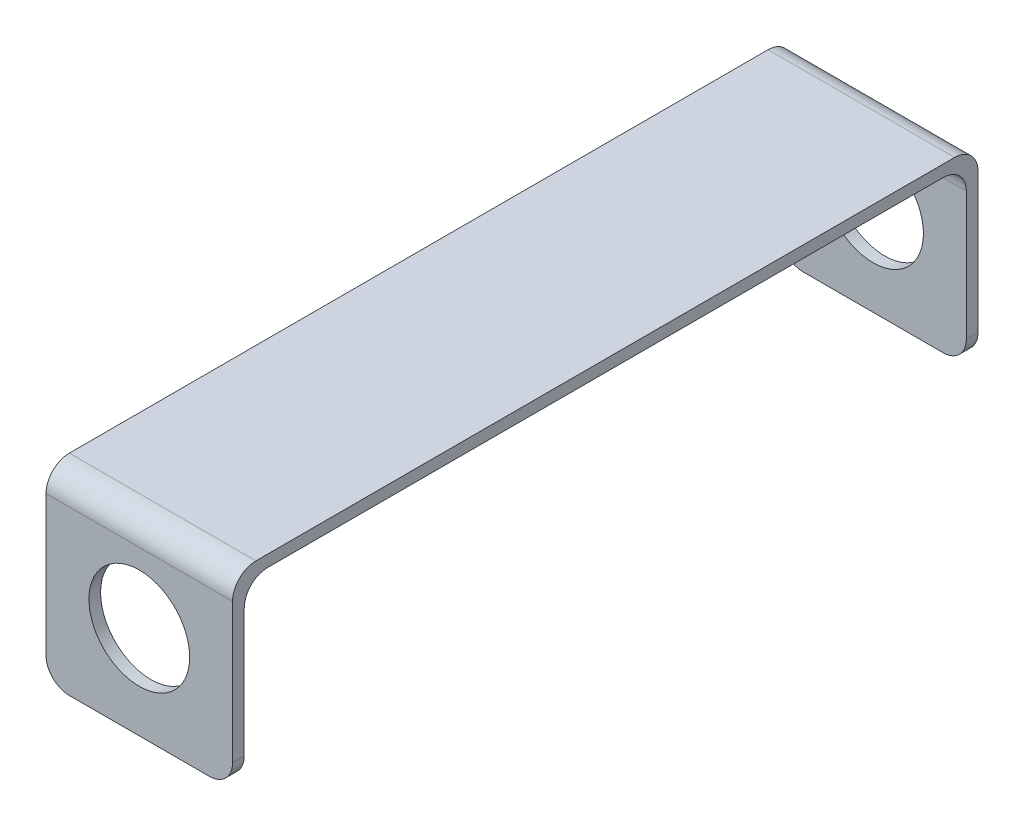
ISO-10303-21;
HEADER;
FILE_DESCRIPTION(('STEP AP214'),'2;1');
FILE_NAME('part.step','',(''),(''),'','','');
FILE_SCHEMA(('AUTOMOTIVE_DESIGN { 1 0 10303 214 1 1 1 1 }'));
ENDSEC;
DATA;
#1=APPLICATION_CONTEXT('core data for automotive mechanical design processes');
#2=APPLICATION_PROTOCOL_DEFINITION('international standard','automotive_design',2000,#1);
#3=PRODUCT_CONTEXT('',#1,'mechanical');
#4=PRODUCT('Part','Part','',(#3));
#5=PRODUCT_RELATED_PRODUCT_CATEGORY('part','',(#4));
#6=PRODUCT_DEFINITION_FORMATION('','',#4);
#7=PRODUCT_DEFINITION_CONTEXT('part definition',#1,'design');
#8=PRODUCT_DEFINITION('design','',#6,#7);
#9=PRODUCT_DEFINITION_SHAPE('','',#8);
#10=(LENGTH_UNIT() NAMED_UNIT(*) SI_UNIT(.MILLI.,.METRE.));
#11=(NAMED_UNIT(*) PLANE_ANGLE_UNIT() SI_UNIT($,.RADIAN.));
#12=(NAMED_UNIT(*) SI_UNIT($,.STERADIAN.) SOLID_ANGLE_UNIT());
#13=UNCERTAINTY_MEASURE_WITH_UNIT(LENGTH_MEASURE(1.E-05),#10,'distance_accuracy_value','');
#14=(GEOMETRIC_REPRESENTATION_CONTEXT(3) GLOBAL_UNCERTAINTY_ASSIGNED_CONTEXT((#13)) GLOBAL_UNIT_ASSIGNED_CONTEXT((#10,
#11,#12)) REPRESENTATION_CONTEXT('',''));
#15=CARTESIAN_POINT('',(0.,0.,0.));
#16=DIRECTION('',(0.,0.,1.));
#17=DIRECTION('',(1.,0.,0.));
#18=AXIS2_PLACEMENT_3D('',#15,#16,#17);
#19=CARTESIAN_POINT('',(730.633019333322,-104.775,98.298));
#20=DIRECTION('',(0.,0.,1.));
#21=DIRECTION('',(0.,-1.,0.));
#22=AXIS2_PLACEMENT_3D('',#19,#20,#21);
#23=PLANE('',#22);
#24=CARTESIAN_POINT('',(756.033019333322,-127.,98.2979999999999));
#25=DIRECTION('',(0.,0.,1.));
#26=DIRECTION('',(0.,-1.,0.));
#27=AXIS2_PLACEMENT_3D('',#24,#25,#26);
#28=CIRCLE('',#27,13.716);
#29=CARTESIAN_POINT('',(756.033019333322,-140.716,98.2979999999999));
#30=VERTEX_POINT('',#29);
#31=EDGE_CURVE('E278',#30,#30,#28,.T.);
#32=ORIENTED_EDGE('',*,*,#31,.T.);
#33=EDGE_LOOP('',(#32));
#34=FACE_BOUND('',#33,.T.);
#35=DIRECTION('',(0.,-1.,0.));
#36=VECTOR('',#35,1.);
#37=CARTESIAN_POINT('',(781.433019333322,-104.775,98.298));
#38=LINE('',#37,#36);
#39=CARTESIAN_POINT('',(781.433019333322,-111.125,98.298));
#40=VERTEX_POINT('',#39);
#41=CARTESIAN_POINT('',(781.433019333322,-146.05,98.2979999999999));
#42=VERTEX_POINT('',#41);
#43=EDGE_CURVE('E255',#40,#42,#38,.T.);
#44=ORIENTED_EDGE('',*,*,#43,.T.);
#45=CARTESIAN_POINT('',(775.083019333322,-146.05,98.2979999999999));
#46=DIRECTION('',(0.,0.,1.));
#47=DIRECTION('',(0.,-1.,0.));
#48=AXIS2_PLACEMENT_3D('',#45,#46,#47);
#49=CIRCLE('',#48,6.35);
#50=CARTESIAN_POINT('',(775.083019333322,-152.4,98.2979999999999));
#51=VERTEX_POINT('',#50);
#52=EDGE_CURVE('E225',#42,#51,#49,.F.);
#53=ORIENTED_EDGE('',*,*,#52,.T.);
#54=DIRECTION('',(1.,0.,0.));
#55=VECTOR('',#54,1.);
#56=CARTESIAN_POINT('',(730.633019333322,-152.4,98.2979999999999));
#57=LINE('',#56,#55);
#58=CARTESIAN_POINT('',(736.983019333322,-152.4,98.2979999999999));
#59=VERTEX_POINT('',#58);
#60=EDGE_CURVE('E185',#59,#51,#57,.T.);
#61=ORIENTED_EDGE('',*,*,#60,.F.);
#62=CARTESIAN_POINT('',(736.983019333322,-146.05,98.2979999999999));
#63=DIRECTION('',(0.,0.,1.));
#64=DIRECTION('',(0.,-1.,0.));
#65=AXIS2_PLACEMENT_3D('',#62,#63,#64);
#66=CIRCLE('',#65,6.35);
#67=CARTESIAN_POINT('',(730.633019333322,-146.05,98.2979999999999));
#68=VERTEX_POINT('',#67);
#69=EDGE_CURVE('E223',#59,#68,#66,.F.);
#70=ORIENTED_EDGE('',*,*,#69,.T.);
#71=DIRECTION('',(0.,-1.,0.));
#72=VECTOR('',#71,1.);
#73=CARTESIAN_POINT('',(730.633019333322,-104.775,98.298));
#74=LINE('',#73,#72);
#75=CARTESIAN_POINT('',(730.633019333322,-111.125,98.298));
#76=VERTEX_POINT('',#75);
#77=EDGE_CURVE('E260',#76,#68,#74,.T.);
#78=ORIENTED_EDGE('',*,*,#77,.F.);
#79=DIRECTION('',(1.,0.,0.));
#80=VECTOR('',#79,1.);
#81=CARTESIAN_POINT('',(781.433019333322,-111.125,98.2979999999999));
#82=LINE('',#81,#80);
#83=EDGE_CURVE('E220',#76,#40,#82,.T.);
#84=ORIENTED_EDGE('',*,*,#83,.T.);
#85=EDGE_LOOP('',(#44,#53,#61,#70,#78,#84));
#86=FACE_BOUND('',#85,.T.);
#87=ADVANCED_FACE('F44',(#34,#86),#23,.F.);
#88=CARTESIAN_POINT('',(730.633019333322,-152.4,98.2979999999999));
#89=DIRECTION('',(0.,1.,0.));
#90=DIRECTION('',(0.,0.,1.));
#91=AXIS2_PLACEMENT_3D('',#88,#89,#90);
#92=PLANE('',#91);
#93=ORIENTED_EDGE('',*,*,#60,.T.);
#94=DIRECTION('',(0.,0.,1.));
#95=VECTOR('',#94,1.);
#96=CARTESIAN_POINT('',(775.083019333322,-152.4,98.2979999999999));
#97=LINE('',#96,#95);
#98=CARTESIAN_POINT('',(775.083019333322,-152.4,101.473));
#99=VERTEX_POINT('',#98);
#100=EDGE_CURVE('E211',#51,#99,#97,.T.);
#101=ORIENTED_EDGE('',*,*,#100,.T.);
#102=DIRECTION('',(1.,0.,0.));
#103=VECTOR('',#102,1.);
#104=CARTESIAN_POINT('',(730.633019333322,-152.4,101.473));
#105=LINE('',#104,#103);
#106=CARTESIAN_POINT('',(736.983019333322,-152.4,101.473));
#107=VERTEX_POINT('',#106);
#108=EDGE_CURVE('E189',#107,#99,#105,.T.);
#109=ORIENTED_EDGE('',*,*,#108,.F.);
#110=DIRECTION('',(0.,0.,1.));
#111=VECTOR('',#110,1.);
#112=CARTESIAN_POINT('',(736.983019333322,-152.4,98.2979999999999));
#113=LINE('',#112,#111);
#114=EDGE_CURVE('E209',#107,#59,#113,.F.);
#115=ORIENTED_EDGE('',*,*,#114,.T.);
#116=EDGE_LOOP('',(#93,#101,#109,#115));
#117=FACE_BOUND('',#116,.T.);
#118=ADVANCED_FACE('F307',(#117),#92,.F.);
#119=CARTESIAN_POINT('',(730.633019333322,-101.6,101.473));
#120=DIRECTION('',(0.,0.,-1.));
#121=DIRECTION('',(0.,1.,0.));
#122=AXIS2_PLACEMENT_3D('',#119,#120,#121);
#123=PLANE('',#122);
#124=CARTESIAN_POINT('',(756.033019333322,-127.,101.473));
#125=DIRECTION('',(0.,0.,-1.));
#126=DIRECTION('',(0.,1.,0.));
#127=AXIS2_PLACEMENT_3D('',#124,#125,#126);
#128=CIRCLE('',#127,13.716);
#129=CARTESIAN_POINT('',(756.033019333322,-113.284,101.473));
#130=VERTEX_POINT('',#129);
#131=EDGE_CURVE('E506',#130,#130,#128,.T.);
#132=ORIENTED_EDGE('',*,*,#131,.T.);
#133=EDGE_LOOP('',(#132));
#134=FACE_BOUND('',#133,.T.);
#135=ORIENTED_EDGE('',*,*,#108,.T.);
#136=CARTESIAN_POINT('',(775.083019333322,-146.05,101.473));
#137=DIRECTION('',(0.,0.,-1.));
#138=DIRECTION('',(0.,1.,0.));
#139=AXIS2_PLACEMENT_3D('',#136,#137,#138);
#140=CIRCLE('',#139,6.35);
#141=CARTESIAN_POINT('',(781.433019333322,-146.05,101.473));
#142=VERTEX_POINT('',#141);
#143=EDGE_CURVE('E218',#99,#142,#140,.F.);
#144=ORIENTED_EDGE('',*,*,#143,.T.);
#145=DIRECTION('',(0.,1.,0.));
#146=VECTOR('',#145,1.);
#147=CARTESIAN_POINT('',(781.433019333322,-101.6,101.473));
#148=LINE('',#147,#146);
#149=CARTESIAN_POINT('',(781.433019333322,-107.95,101.473));
#150=VERTEX_POINT('',#149);
#151=EDGE_CURVE('E288',#142,#150,#148,.T.);
#152=ORIENTED_EDGE('',*,*,#151,.T.);
#153=DIRECTION('',(1.,0.,0.));
#154=VECTOR('',#153,1.);
#155=CARTESIAN_POINT('',(730.633019333322,-107.95,101.473));
#156=LINE('',#155,#154);
#157=CARTESIAN_POINT('',(730.633019333322,-107.95,101.473));
#158=VERTEX_POINT('',#157);
#159=EDGE_CURVE('E214',#150,#158,#156,.F.);
#160=ORIENTED_EDGE('',*,*,#159,.T.);
#161=DIRECTION('',(0.,1.,0.));
#162=VECTOR('',#161,1.);
#163=CARTESIAN_POINT('',(730.633019333322,-101.6,101.473));
#164=LINE('',#163,#162);
#165=CARTESIAN_POINT('',(730.633019333322,-146.05,101.473));
#166=VERTEX_POINT('',#165);
#167=EDGE_CURVE('E272',#166,#158,#164,.T.);
#168=ORIENTED_EDGE('',*,*,#167,.F.);
#169=CARTESIAN_POINT('',(736.983019333322,-146.05,101.473));
#170=DIRECTION('',(0.,0.,-1.));
#171=DIRECTION('',(0.,1.,0.));
#172=AXIS2_PLACEMENT_3D('',#169,#170,#171);
#173=CIRCLE('',#172,6.35);
#174=EDGE_CURVE('E216',#166,#107,#173,.F.);
#175=ORIENTED_EDGE('',*,*,#174,.T.);
#176=EDGE_LOOP('',(#135,#144,#152,#160,#168,#175));
#177=FACE_BOUND('',#176,.T.);
#178=ADVANCED_FACE('F302',(#134,#177),#123,.F.);
#179=CARTESIAN_POINT('',(730.633019333322,-101.6,101.473));
#180=DIRECTION('',(0.,-1.,0.));
#181=DIRECTION('',(0.,0.,-1.));
#182=AXIS2_PLACEMENT_3D('',#179,#180,#181);
#183=PLANE('',#182);
#184=DIRECTION('',(0.,0.,-1.));
#185=VECTOR('',#184,1.);
#186=CARTESIAN_POINT('',(781.433019333322,-101.6,101.473));
#187=LINE('',#186,#185);
#188=CARTESIAN_POINT('',(781.433019333322,-101.6,95.1229999999999));
#189=VERTEX_POINT('',#188);
#190=CARTESIAN_POINT('',(781.433019333322,-101.6,-95.1230000000001));
#191=VERTEX_POINT('',#190);
#192=EDGE_CURVE('E291',#189,#191,#187,.T.);
#193=ORIENTED_EDGE('',*,*,#192,.T.);
#194=DIRECTION('',(1.,0.,0.));
#195=VECTOR('',#194,1.);
#196=CARTESIAN_POINT('',(730.633019333322,-101.6,-95.1230000000001));
#197=LINE('',#196,#195);
#198=CARTESIAN_POINT('',(730.633019333322,-101.6,-95.1230000000001));
#199=VERTEX_POINT('',#198);
#200=EDGE_CURVE('E243',#191,#199,#197,.F.);
#201=ORIENTED_EDGE('',*,*,#200,.T.);
#202=DIRECTION('',(0.,0.,-1.));
#203=VECTOR('',#202,1.);
#204=CARTESIAN_POINT('',(730.633019333322,-101.6,101.473));
#205=LINE('',#204,#203);
#206=CARTESIAN_POINT('',(730.633019333322,-101.6,95.1229999999999));
#207=VERTEX_POINT('',#206);
#208=EDGE_CURVE('E275',#207,#199,#205,.T.);
#209=ORIENTED_EDGE('',*,*,#208,.F.);
#210=DIRECTION('',(1.,0.,0.));
#211=VECTOR('',#210,1.);
#212=CARTESIAN_POINT('',(730.633019333322,-101.6,95.1229999999999));
#213=LINE('',#212,#211);
#214=EDGE_CURVE('E240',#207,#189,#213,.T.);
#215=ORIENTED_EDGE('',*,*,#214,.T.);
#216=EDGE_LOOP('',(#193,#201,#209,#215));
#217=FACE_BOUND('',#216,.T.);
#218=ADVANCED_FACE('F319',(#217),#183,.F.);
#219=CARTESIAN_POINT('',(730.633019333322,-101.6,-101.473));
#220=DIRECTION('',(0.,0.,1.));
#221=DIRECTION('',(1.,0.,0.));
#222=AXIS2_PLACEMENT_3D('',#219,#220,#221);
#223=PLANE('',#222);
#224=CARTESIAN_POINT('',(756.033019333322,-127.,-101.473));
#225=DIRECTION('',(0.,0.,1.));
#226=DIRECTION('',(1.,0.,0.));
#227=AXIS2_PLACEMENT_3D('',#224,#225,#226);
#228=CIRCLE('',#227,13.716);
#229=CARTESIAN_POINT('',(769.749019333322,-127.,-101.473));
#230=VERTEX_POINT('',#229);
#231=EDGE_CURVE('E507',#230,#230,#228,.T.);
#232=ORIENTED_EDGE('',*,*,#231,.T.);
#233=EDGE_LOOP('',(#232));
#234=FACE_BOUND('',#233,.T.);
#235=DIRECTION('',(0.,-1.,0.));
#236=VECTOR('',#235,1.);
#237=CARTESIAN_POINT('',(781.433019333322,-101.6,-101.473));
#238=LINE('',#237,#236);
#239=CARTESIAN_POINT('',(781.433019333322,-107.95,-101.473));
#240=VERTEX_POINT('',#239);
#241=CARTESIAN_POINT('',(781.433019333322,-146.05,-101.473));
#242=VERTEX_POINT('',#241);
#243=EDGE_CURVE('E294',#240,#242,#238,.T.);
#244=ORIENTED_EDGE('',*,*,#243,.T.);
#245=CARTESIAN_POINT('',(775.083019333322,-146.05,-101.473));
#246=DIRECTION('',(0.,0.,1.));
#247=DIRECTION('',(1.,0.,0.));
#248=AXIS2_PLACEMENT_3D('',#245,#246,#247);
#249=CIRCLE('',#248,6.35);
#250=CARTESIAN_POINT('',(775.083019333322,-152.4,-101.473));
#251=VERTEX_POINT('',#250);
#252=EDGE_CURVE('E207',#242,#251,#249,.F.);
#253=ORIENTED_EDGE('',*,*,#252,.T.);
#254=DIRECTION('',(1.,0.,0.));
#255=VECTOR('',#254,1.);
#256=CARTESIAN_POINT('',(730.633019333322,-152.4,-101.473));
#257=LINE('',#256,#255);
#258=CARTESIAN_POINT('',(736.983019333322,-152.4,-101.473));
#259=VERTEX_POINT('',#258);
#260=EDGE_CURVE('E179',#259,#251,#257,.T.);
#261=ORIENTED_EDGE('',*,*,#260,.F.);
#262=CARTESIAN_POINT('',(736.983019333322,-146.05,-101.473));
#263=DIRECTION('',(0.,0.,1.));
#264=DIRECTION('',(1.,0.,0.));
#265=AXIS2_PLACEMENT_3D('',#262,#263,#264);
#266=CIRCLE('',#265,6.35);
#267=CARTESIAN_POINT('',(730.633019333322,-146.05,-101.473));
#268=VERTEX_POINT('',#267);
#269=EDGE_CURVE('E184',#259,#268,#266,.F.);
#270=ORIENTED_EDGE('',*,*,#269,.T.);
#271=DIRECTION('',(0.,-1.,0.));
#272=VECTOR('',#271,1.);
#273=CARTESIAN_POINT('',(730.633019333322,-101.6,-101.473));
#274=LINE('',#273,#272);
#275=CARTESIAN_POINT('',(730.633019333322,-107.95,-101.473));
#276=VERTEX_POINT('',#275);
#277=EDGE_CURVE('E283',#276,#268,#274,.T.);
#278=ORIENTED_EDGE('',*,*,#277,.F.);
#279=DIRECTION('',(1.,0.,0.));
#280=VECTOR('',#279,1.);
#281=CARTESIAN_POINT('',(730.633019333322,-107.95,-101.473));
#282=LINE('',#281,#280);
#283=EDGE_CURVE('E203',#276,#240,#282,.T.);
#284=ORIENTED_EDGE('',*,*,#283,.T.);
#285=EDGE_LOOP('',(#244,#253,#261,#270,#278,#284));
#286=FACE_BOUND('',#285,.T.);
#287=ADVANCED_FACE('F327',(#234,#286),#223,.F.);
#288=CARTESIAN_POINT('',(730.633019333322,-152.4,-98.2980000000001));
#289=DIRECTION('',(0.,1.,0.));
#290=DIRECTION('',(0.,0.,1.));
#291=AXIS2_PLACEMENT_3D('',#288,#289,#290);
#292=PLANE('',#291);
#293=ORIENTED_EDGE('',*,*,#260,.T.);
#294=DIRECTION('',(0.,0.,1.));
#295=VECTOR('',#294,1.);
#296=CARTESIAN_POINT('',(775.083019333322,-152.4,-98.2980000000001));
#297=LINE('',#296,#295);
#298=CARTESIAN_POINT('',(775.083019333322,-152.4,-98.2980000000001));
#299=VERTEX_POINT('',#298);
#300=EDGE_CURVE('E178',#251,#299,#297,.T.);
#301=ORIENTED_EDGE('',*,*,#300,.T.);
#302=DIRECTION('',(1.,0.,0.));
#303=VECTOR('',#302,1.);
#304=CARTESIAN_POINT('',(730.633019333322,-152.4,-98.2980000000001));
#305=LINE('',#304,#303);
#306=CARTESIAN_POINT('',(736.983019333322,-152.4,-98.2980000000001));
#307=VERTEX_POINT('',#306);
#308=EDGE_CURVE('E162',#307,#299,#305,.T.);
#309=ORIENTED_EDGE('',*,*,#308,.F.);
#310=DIRECTION('',(0.,0.,1.));
#311=VECTOR('',#310,1.);
#312=CARTESIAN_POINT('',(736.983019333322,-152.4,-101.473));
#313=LINE('',#312,#311);
#314=EDGE_CURVE('E175',#307,#259,#313,.F.);
#315=ORIENTED_EDGE('',*,*,#314,.T.);
#316=EDGE_LOOP('',(#293,#301,#309,#315));
#317=FACE_BOUND('',#316,.T.);
#318=ADVANCED_FACE('F174',(#317),#292,.F.);
#319=CARTESIAN_POINT('',(730.633019333322,-104.775,-98.2980000000001));
#320=DIRECTION('',(0.,0.,-1.));
#321=DIRECTION('',(-1.,0.,0.));
#322=AXIS2_PLACEMENT_3D('',#319,#320,#321);
#323=PLANE('',#322);
#324=CARTESIAN_POINT('',(756.033019333322,-127.,-98.2980000000001));
#325=DIRECTION('',(0.,0.,-1.));
#326=DIRECTION('',(-1.,0.,0.));
#327=AXIS2_PLACEMENT_3D('',#324,#325,#326);
#328=CIRCLE('',#327,13.716);
#329=CARTESIAN_POINT('',(742.317019333322,-127.,-98.2980000000001));
#330=VERTEX_POINT('',#329);
#331=EDGE_CURVE('E48',#330,#330,#328,.T.);
#332=ORIENTED_EDGE('',*,*,#331,.T.);
#333=EDGE_LOOP('',(#332));
#334=FACE_BOUND('',#333,.T.);
#335=ORIENTED_EDGE('',*,*,#308,.T.);
#336=CARTESIAN_POINT('',(775.083019333322,-146.05,-98.2980000000001));
#337=DIRECTION('',(0.,0.,-1.));
#338=DIRECTION('',(-1.,0.,0.));
#339=AXIS2_PLACEMENT_3D('',#336,#337,#338);
#340=CIRCLE('',#339,6.35);
#341=CARTESIAN_POINT('',(781.433019333322,-146.05,-98.2980000000001));
#342=VERTEX_POINT('',#341);
#343=EDGE_CURVE('E168',#299,#342,#340,.F.);
#344=ORIENTED_EDGE('',*,*,#343,.T.);
#345=DIRECTION('',(0.,1.,0.));
#346=VECTOR('',#345,1.);
#347=CARTESIAN_POINT('',(781.433019333322,-104.775,-98.2980000000001));
#348=LINE('',#347,#346);
#349=CARTESIAN_POINT('',(781.433019333322,-111.125,-98.2980000000001));
#350=VERTEX_POINT('',#349);
#351=EDGE_CURVE('E261',#342,#350,#348,.T.);
#352=ORIENTED_EDGE('',*,*,#351,.T.);
#353=DIRECTION('',(1.,0.,0.));
#354=VECTOR('',#353,1.);
#355=CARTESIAN_POINT('',(730.633019333322,-111.125,-98.2980000000001));
#356=LINE('',#355,#354);
#357=CARTESIAN_POINT('',(730.633019333322,-111.125,-98.2980000000001));
#358=VERTEX_POINT('',#357);
#359=EDGE_CURVE('E169',#350,#358,#356,.F.);
#360=ORIENTED_EDGE('',*,*,#359,.T.);
#361=DIRECTION('',(0.,1.,0.));
#362=VECTOR('',#361,1.);
#363=CARTESIAN_POINT('',(730.633019333322,-104.775,-98.2980000000001));
#364=LINE('',#363,#362);
#365=CARTESIAN_POINT('',(730.633019333322,-146.05,-98.2980000000001));
#366=VERTEX_POINT('',#365);
#367=EDGE_CURVE('E163',#366,#358,#364,.T.);
#368=ORIENTED_EDGE('',*,*,#367,.F.);
#369=CARTESIAN_POINT('',(736.983019333322,-146.05,-98.2980000000001));
#370=DIRECTION('',(0.,0.,-1.));
#371=DIRECTION('',(-1.,0.,0.));
#372=AXIS2_PLACEMENT_3D('',#369,#370,#371);
#373=CIRCLE('',#372,6.35);
#374=EDGE_CURVE('E159',#366,#307,#373,.F.);
#375=ORIENTED_EDGE('',*,*,#374,.T.);
#376=EDGE_LOOP('',(#335,#344,#352,#360,#368,#375));
#377=FACE_BOUND('',#376,.T.);
#378=ADVANCED_FACE('F161',(#334,#377),#323,.F.);
#379=CARTESIAN_POINT('',(730.633019333322,-104.775,98.298));
#380=DIRECTION('',(0.,1.,0.));
#381=DIRECTION('',(0.,0.,1.));
#382=AXIS2_PLACEMENT_3D('',#379,#380,#381);
#383=PLANE('',#382);
#384=DIRECTION('',(0.,0.,1.));
#385=VECTOR('',#384,1.);
#386=CARTESIAN_POINT('',(730.633019333322,-104.775,98.298));
#387=LINE('',#386,#385);
#388=CARTESIAN_POINT('',(730.633019333322,-104.775,-91.9480000000001));
#389=VERTEX_POINT('',#388);
#390=CARTESIAN_POINT('',(730.633019333322,-104.775,91.948));
#391=VERTEX_POINT('',#390);
#392=EDGE_CURVE('E180',#389,#391,#387,.T.);
#393=ORIENTED_EDGE('',*,*,#392,.F.);
#394=DIRECTION('',(1.,0.,0.));
#395=VECTOR('',#394,1.);
#396=CARTESIAN_POINT('',(781.433019333322,-104.775,-91.9480000000001));
#397=LINE('',#396,#395);
#398=CARTESIAN_POINT('',(781.433019333322,-104.775,-91.9480000000001));
#399=VERTEX_POINT('',#398);
#400=EDGE_CURVE('E237',#389,#399,#397,.T.);
#401=ORIENTED_EDGE('',*,*,#400,.T.);
#402=DIRECTION('',(0.,0.,1.));
#403=VECTOR('',#402,1.);
#404=CARTESIAN_POINT('',(781.433019333322,-104.775,98.298));
#405=LINE('',#404,#403);
#406=CARTESIAN_POINT('',(781.433019333322,-104.775,91.948));
#407=VERTEX_POINT('',#406);
#408=EDGE_CURVE('E253',#399,#407,#405,.T.);
#409=ORIENTED_EDGE('',*,*,#408,.T.);
#410=DIRECTION('',(1.,0.,0.));
#411=VECTOR('',#410,1.);
#412=CARTESIAN_POINT('',(730.633019333322,-104.775,91.948));
#413=LINE('',#412,#411);
#414=EDGE_CURVE('E60',#407,#391,#413,.F.);
#415=ORIENTED_EDGE('',*,*,#414,.T.);
#416=EDGE_LOOP('',(#393,#401,#409,#415));
#417=FACE_BOUND('',#416,.T.);
#418=ADVANCED_FACE('F258',(#417),#383,.F.);
#419=CARTESIAN_POINT('',(730.633019333322,0.,0.));
#420=DIRECTION('',(-1.,0.,0.));
#421=DIRECTION('',(0.,0.,1.));
#422=AXIS2_PLACEMENT_3D('',#419,#420,#421);
#423=PLANE('',#422);
#424=ORIENTED_EDGE('',*,*,#277,.T.);
#425=DIRECTION('',(0.,0.,1.));
#426=VECTOR('',#425,1.);
#427=CARTESIAN_POINT('',(730.633019333322,-146.05,-98.2980000000001));
#428=LINE('',#427,#426);
#429=EDGE_CURVE('E234',#268,#366,#428,.T.);
#430=ORIENTED_EDGE('',*,*,#429,.T.);
#431=ORIENTED_EDGE('',*,*,#367,.T.);
#432=CARTESIAN_POINT('',(730.633019333322,-111.125,-91.9480000000001));
#433=DIRECTION('',(-1.,0.,0.));
#434=DIRECTION('',(0.,0.,1.));
#435=AXIS2_PLACEMENT_3D('',#432,#433,#434);
#436=CIRCLE('',#435,6.35);
#437=EDGE_CURVE('E67',#358,#389,#436,.F.);
#438=ORIENTED_EDGE('',*,*,#437,.T.);
#439=ORIENTED_EDGE('',*,*,#392,.T.);
#440=CARTESIAN_POINT('',(730.633019333322,-111.125,91.948));
#441=DIRECTION('',(-1.,0.,0.));
#442=DIRECTION('',(0.,0.,1.));
#443=AXIS2_PLACEMENT_3D('',#440,#441,#442);
#444=CIRCLE('',#443,6.35);
#445=EDGE_CURVE('E13',#391,#76,#444,.F.);
#446=ORIENTED_EDGE('',*,*,#445,.T.);
#447=ORIENTED_EDGE('',*,*,#77,.T.);
#448=DIRECTION('',(0.,0.,1.));
#449=VECTOR('',#448,1.);
#450=CARTESIAN_POINT('',(730.633019333322,-146.05,101.473));
#451=LINE('',#450,#449);
#452=EDGE_CURVE('E231',#68,#166,#451,.T.);
#453=ORIENTED_EDGE('',*,*,#452,.T.);
#454=ORIENTED_EDGE('',*,*,#167,.T.);
#455=CARTESIAN_POINT('',(730.633019333322,-107.95,95.1229999999999));
#456=DIRECTION('',(-1.,0.,0.));
#457=DIRECTION('',(0.,0.,1.));
#458=AXIS2_PLACEMENT_3D('',#455,#456,#457);
#459=CIRCLE('',#458,6.35);
#460=EDGE_CURVE('E227',#158,#207,#459,.T.);
#461=ORIENTED_EDGE('',*,*,#460,.T.);
#462=ORIENTED_EDGE('',*,*,#208,.T.);
#463=CARTESIAN_POINT('',(730.633019333322,-107.95,-95.1230000000001));
#464=DIRECTION('',(-1.,0.,0.));
#465=DIRECTION('',(0.,0.,1.));
#466=AXIS2_PLACEMENT_3D('',#463,#464,#465);
#467=CIRCLE('',#466,6.35);
#468=EDGE_CURVE('E229',#199,#276,#467,.T.);
#469=ORIENTED_EDGE('',*,*,#468,.T.);
#470=EDGE_LOOP('',(#424,#430,#431,#438,#439,#446,#447,#453,#454,#461,#462,#469));
#471=FACE_BOUND('',#470,.T.);
#472=ADVANCED_FACE('F267',(#471),#423,.T.);
#473=CARTESIAN_POINT('',(781.433019333322,0.,0.));
#474=DIRECTION('',(-1.,0.,0.));
#475=DIRECTION('',(0.,0.,1.));
#476=AXIS2_PLACEMENT_3D('',#473,#474,#475);
#477=PLANE('',#476);
#478=ORIENTED_EDGE('',*,*,#351,.F.);
#479=DIRECTION('',(0.,0.,1.));
#480=VECTOR('',#479,1.);
#481=CARTESIAN_POINT('',(781.433019333322,-146.049999999999,1.27364587544909E-12));
#482=LINE('',#481,#480);
#483=EDGE_CURVE('E201',#342,#242,#482,.F.);
#484=ORIENTED_EDGE('',*,*,#483,.T.);
#485=ORIENTED_EDGE('',*,*,#243,.F.);
#486=CARTESIAN_POINT('',(781.433019333322,-107.95,-95.1230000000001));
#487=DIRECTION('',(-1.,0.,0.));
#488=DIRECTION('',(0.,0.,1.));
#489=AXIS2_PLACEMENT_3D('',#486,#487,#488);
#490=CIRCLE('',#489,6.35);
#491=EDGE_CURVE('E197',#240,#191,#490,.F.);
#492=ORIENTED_EDGE('',*,*,#491,.T.);
#493=ORIENTED_EDGE('',*,*,#192,.F.);
#494=CARTESIAN_POINT('',(781.433019333322,-107.95,95.1229999999999));
#495=DIRECTION('',(-1.,0.,0.));
#496=DIRECTION('',(0.,0.,1.));
#497=AXIS2_PLACEMENT_3D('',#494,#495,#496);
#498=CIRCLE('',#497,6.35);
#499=EDGE_CURVE('E195',#189,#150,#498,.F.);
#500=ORIENTED_EDGE('',*,*,#499,.T.);
#501=ORIENTED_EDGE('',*,*,#151,.F.);
#502=DIRECTION('',(0.,0.,1.));
#503=VECTOR('',#502,1.);
#504=CARTESIAN_POINT('',(781.433019333322,-146.05,0.));
#505=LINE('',#504,#503);
#506=EDGE_CURVE('E199',#142,#42,#505,.F.);
#507=ORIENTED_EDGE('',*,*,#506,.T.);
#508=ORIENTED_EDGE('',*,*,#43,.F.);
#509=CARTESIAN_POINT('',(781.433019333322,-111.125,91.948));
#510=DIRECTION('',(-1.,0.,0.));
#511=DIRECTION('',(0.,0.,1.));
#512=AXIS2_PLACEMENT_3D('',#509,#510,#511);
#513=CIRCLE('',#512,6.35);
#514=EDGE_CURVE('E53',#40,#407,#513,.T.);
#515=ORIENTED_EDGE('',*,*,#514,.T.);
#516=ORIENTED_EDGE('',*,*,#408,.F.);
#517=CARTESIAN_POINT('',(781.433019333322,-111.125,-91.9480000000001));
#518=DIRECTION('',(-1.,0.,0.));
#519=DIRECTION('',(0.,0.,1.));
#520=AXIS2_PLACEMENT_3D('',#517,#518,#519);
#521=CIRCLE('',#520,6.35);
#522=EDGE_CURVE('E245',#399,#350,#521,.T.);
#523=ORIENTED_EDGE('',*,*,#522,.T.);
#524=EDGE_LOOP('',(#478,#484,#485,#492,#493,#500,#501,#507,#508,#515,#516,#523));
#525=FACE_BOUND('',#524,.T.);
#526=ADVANCED_FACE('F252',(#525),#477,.F.);
#527=CARTESIAN_POINT('',(775.083019333322,-146.05,-98.2980000000001));
#528=DIRECTION('',(0.,0.,1.));
#529=DIRECTION('',(0.,-1.,0.));
#530=AXIS2_PLACEMENT_3D('',#527,#528,#529);
#531=CYLINDRICAL_SURFACE('',#530,6.35);
#532=ORIENTED_EDGE('',*,*,#252,.F.);
#533=ORIENTED_EDGE('',*,*,#483,.F.);
#534=ORIENTED_EDGE('',*,*,#343,.F.);
#535=ORIENTED_EDGE('',*,*,#300,.F.);
#536=EDGE_LOOP('',(#532,#533,#534,#535));
#537=FACE_BOUND('',#536,.T.);
#538=ADVANCED_FACE('F331',(#537),#531,.T.);
#539=CARTESIAN_POINT('',(775.083019333322,-146.05,98.2979999999999));
#540=DIRECTION('',(0.,0.,1.));
#541=DIRECTION('',(1.,0.,0.));
#542=AXIS2_PLACEMENT_3D('',#539,#540,#541);
#543=CYLINDRICAL_SURFACE('',#542,6.35);
#544=ORIENTED_EDGE('',*,*,#52,.F.);
#545=ORIENTED_EDGE('',*,*,#506,.F.);
#546=ORIENTED_EDGE('',*,*,#143,.F.);
#547=ORIENTED_EDGE('',*,*,#100,.F.);
#548=EDGE_LOOP('',(#544,#545,#546,#547));
#549=FACE_BOUND('',#548,.T.);
#550=ADVANCED_FACE('F356',(#549),#543,.T.);
#551=CARTESIAN_POINT('',(736.983019333322,-146.049999999999,1.27986708118876E-12));
#552=DIRECTION('',(0.,0.,-1.));
#553=DIRECTION('',(0.,1.,0.));
#554=AXIS2_PLACEMENT_3D('',#551,#552,#553);
#555=CYLINDRICAL_SURFACE('',#554,6.35);
#556=ORIENTED_EDGE('',*,*,#269,.F.);
#557=ORIENTED_EDGE('',*,*,#314,.F.);
#558=ORIENTED_EDGE('',*,*,#374,.F.);
#559=ORIENTED_EDGE('',*,*,#429,.F.);
#560=EDGE_LOOP('',(#556,#557,#558,#559));
#561=FACE_BOUND('',#560,.T.);
#562=ADVANCED_FACE('F183',(#561),#555,.T.);
#563=CARTESIAN_POINT('',(736.983019333322,-146.05,0.));
#564=DIRECTION('',(0.,0.,-1.));
#565=DIRECTION('',(-1.,0.,0.));
#566=AXIS2_PLACEMENT_3D('',#563,#564,#565);
#567=CYLINDRICAL_SURFACE('',#566,6.35);
#568=ORIENTED_EDGE('',*,*,#69,.F.);
#569=ORIENTED_EDGE('',*,*,#114,.F.);
#570=ORIENTED_EDGE('',*,*,#174,.F.);
#571=ORIENTED_EDGE('',*,*,#452,.F.);
#572=EDGE_LOOP('',(#568,#569,#570,#571));
#573=FACE_BOUND('',#572,.T.);
#574=ADVANCED_FACE('F310',(#573),#567,.T.);
#575=CARTESIAN_POINT('',(730.633019333322,-111.125,-91.9480000000001));
#576=DIRECTION('',(-1.,0.,0.));
#577=DIRECTION('',(0.,0.,1.));
#578=AXIS2_PLACEMENT_3D('',#575,#576,#577);
#579=CYLINDRICAL_SURFACE('',#578,6.35);
#580=ORIENTED_EDGE('',*,*,#437,.F.);
#581=ORIENTED_EDGE('',*,*,#359,.F.);
#582=ORIENTED_EDGE('',*,*,#522,.F.);
#583=ORIENTED_EDGE('',*,*,#400,.F.);
#584=EDGE_LOOP('',(#580,#581,#582,#583));
#585=FACE_BOUND('',#584,.T.);
#586=ADVANCED_FACE('F335',(#585),#579,.F.);
#587=CARTESIAN_POINT('',(730.633019333322,-107.95,-95.1230000000001));
#588=DIRECTION('',(1.,0.,0.));
#589=DIRECTION('',(0.,0.,-1.));
#590=AXIS2_PLACEMENT_3D('',#587,#588,#589);
#591=CYLINDRICAL_SURFACE('',#590,6.35);
#592=ORIENTED_EDGE('',*,*,#468,.F.);
#593=ORIENTED_EDGE('',*,*,#200,.F.);
#594=ORIENTED_EDGE('',*,*,#491,.F.);
#595=ORIENTED_EDGE('',*,*,#283,.F.);
#596=EDGE_LOOP('',(#592,#593,#594,#595));
#597=FACE_BOUND('',#596,.T.);
#598=ADVANCED_FACE('F323',(#597),#591,.T.);
#599=CARTESIAN_POINT('',(730.633019333322,-107.95,95.1229999999999));
#600=DIRECTION('',(1.,0.,0.));
#601=DIRECTION('',(0.,0.,-1.));
#602=AXIS2_PLACEMENT_3D('',#599,#600,#601);
#603=CYLINDRICAL_SURFACE('',#602,6.35);
#604=ORIENTED_EDGE('',*,*,#460,.F.);
#605=ORIENTED_EDGE('',*,*,#159,.F.);
#606=ORIENTED_EDGE('',*,*,#499,.F.);
#607=ORIENTED_EDGE('',*,*,#214,.F.);
#608=EDGE_LOOP('',(#604,#605,#606,#607));
#609=FACE_BOUND('',#608,.T.);
#610=ADVANCED_FACE('F314',(#609),#603,.T.);
#611=CARTESIAN_POINT('',(730.633019333322,-111.125,91.948));
#612=DIRECTION('',(-1.,0.,0.));
#613=DIRECTION('',(0.,0.,1.));
#614=AXIS2_PLACEMENT_3D('',#611,#612,#613);
#615=CYLINDRICAL_SURFACE('',#614,6.35);
#616=ORIENTED_EDGE('',*,*,#445,.F.);
#617=ORIENTED_EDGE('',*,*,#414,.F.);
#618=ORIENTED_EDGE('',*,*,#514,.F.);
#619=ORIENTED_EDGE('',*,*,#83,.F.);
#620=EDGE_LOOP('',(#616,#617,#618,#619));
#621=FACE_BOUND('',#620,.T.);
#622=ADVANCED_FACE('F46',(#621),#615,.F.);
#623=CARTESIAN_POINT('',(756.033019333322,-127.,-152.4));
#624=DIRECTION('',(0.,0.,1.));
#625=DIRECTION('',(1.,0.,0.));
#626=AXIS2_PLACEMENT_3D('',#623,#624,#625);
#627=CYLINDRICAL_SURFACE('',#626,13.716);
#628=ORIENTED_EDGE('',*,*,#331,.F.);
#629=EDGE_LOOP('',(#628));
#630=FACE_BOUND('',#629,.T.);
#631=ORIENTED_EDGE('',*,*,#231,.F.);
#632=EDGE_LOOP('',(#631));
#633=FACE_BOUND('',#632,.T.);
#634=ADVANCED_FACE('F398',(#630,#633),#627,.F.);
#635=ORIENTED_EDGE('',*,*,#131,.F.);
#636=EDGE_LOOP('',(#635));
#637=FACE_BOUND('',#636,.T.);
#638=ORIENTED_EDGE('',*,*,#31,.F.);
#639=EDGE_LOOP('',(#638));
#640=FACE_BOUND('',#639,.T.);
#641=ADVANCED_FACE('F406',(#637,#640),#627,.F.);
#642=CLOSED_SHELL('',(#87,#118,#178,#218,#287,#318,#378,#418,#472,#526,#538,#550,#562,#574,#586,
#598,#610,#622,#634,#641));
#643=MANIFOLD_SOLID_BREP('B2',#642);
#644=ADVANCED_BREP_SHAPE_REPRESENTATION('',(#18,#643),#14);
#645=SHAPE_DEFINITION_REPRESENTATION(#9,#644);
ENDSEC;
END-ISO-10303-21;
